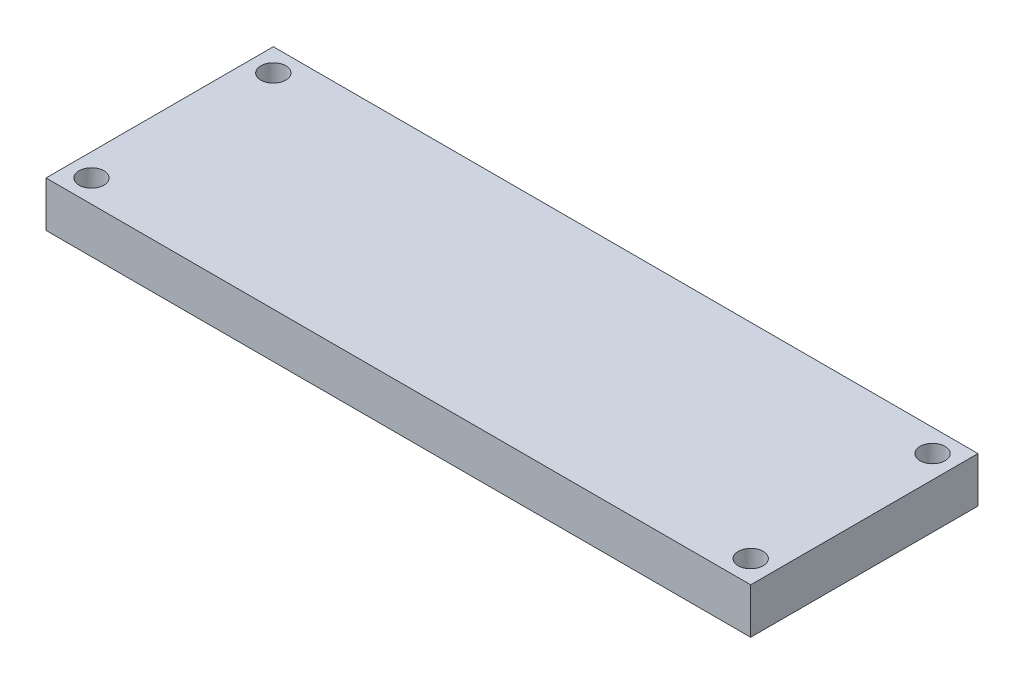
ISO-10303-21;
HEADER;
FILE_DESCRIPTION(('STEP AP214'),'2;1');
FILE_NAME('part.step','',(''),(''),'','','');
FILE_SCHEMA(('AUTOMOTIVE_DESIGN { 1 0 10303 214 1 1 1 1 }'));
ENDSEC;
DATA;
#1=APPLICATION_CONTEXT('core data for automotive mechanical design processes');
#2=APPLICATION_PROTOCOL_DEFINITION('international standard','automotive_design',2000,#1);
#3=PRODUCT_CONTEXT('',#1,'mechanical');
#4=PRODUCT('Part','Part','',(#3));
#5=PRODUCT_RELATED_PRODUCT_CATEGORY('part','',(#4));
#6=PRODUCT_DEFINITION_FORMATION('','',#4);
#7=PRODUCT_DEFINITION_CONTEXT('part definition',#1,'design');
#8=PRODUCT_DEFINITION('design','',#6,#7);
#9=PRODUCT_DEFINITION_SHAPE('','',#8);
#10=(LENGTH_UNIT() NAMED_UNIT(*) SI_UNIT(.MILLI.,.METRE.));
#11=(NAMED_UNIT(*) PLANE_ANGLE_UNIT() SI_UNIT($,.RADIAN.));
#12=(NAMED_UNIT(*) SI_UNIT($,.STERADIAN.) SOLID_ANGLE_UNIT());
#13=UNCERTAINTY_MEASURE_WITH_UNIT(LENGTH_MEASURE(1.E-05),#10,'distance_accuracy_value','');
#14=(GEOMETRIC_REPRESENTATION_CONTEXT(3) GLOBAL_UNCERTAINTY_ASSIGNED_CONTEXT((#13)) GLOBAL_UNIT_ASSIGNED_CONTEXT((#10,
#11,#12)) REPRESENTATION_CONTEXT('',''));
#15=CARTESIAN_POINT('',(0.,0.,0.));
#16=DIRECTION('',(0.,0.,1.));
#17=DIRECTION('',(1.,0.,0.));
#18=AXIS2_PLACEMENT_3D('',#15,#16,#17);
#19=CARTESIAN_POINT('',(0.,2.,0.));
#20=DIRECTION('',(0.,-1.,0.));
#21=DIRECTION('',(0.,0.,-1.));
#22=AXIS2_PLACEMENT_3D('',#19,#20,#21);
#23=PLANE('',#22);
#24=DIRECTION('',(0.,0.,-1.));
#25=VECTOR('',#24,1.);
#26=CARTESIAN_POINT('',(15.5,2.,5.));
#27=LINE('',#26,#25);
#28=CARTESIAN_POINT('',(15.5,2.,5.));
#29=VERTEX_POINT('',#28);
#30=CARTESIAN_POINT('',(15.5,2.,-5.));
#31=VERTEX_POINT('',#30);
#32=EDGE_CURVE('E85',#29,#31,#27,.T.);
#33=ORIENTED_EDGE('',*,*,#32,.T.);
#34=DIRECTION('',(-1.,0.,0.));
#35=VECTOR('',#34,1.);
#36=CARTESIAN_POINT('',(-15.5,2.,-5.));
#37=LINE('',#36,#35);
#38=CARTESIAN_POINT('',(-15.5,2.,-5.));
#39=VERTEX_POINT('',#38);
#40=EDGE_CURVE('E80',#31,#39,#37,.T.);
#41=ORIENTED_EDGE('',*,*,#40,.T.);
#42=DIRECTION('',(0.,0.,1.));
#43=VECTOR('',#42,1.);
#44=CARTESIAN_POINT('',(-15.5,2.,5.));
#45=LINE('',#44,#43);
#46=CARTESIAN_POINT('',(-15.5,2.,5.));
#47=VERTEX_POINT('',#46);
#48=EDGE_CURVE('E83',#39,#47,#45,.T.);
#49=ORIENTED_EDGE('',*,*,#48,.T.);
#50=DIRECTION('',(1.,0.,0.));
#51=VECTOR('',#50,1.);
#52=CARTESIAN_POINT('',(-15.5,2.,5.));
#53=LINE('',#52,#51);
#54=EDGE_CURVE('E50',#47,#29,#53,.T.);
#55=ORIENTED_EDGE('',*,*,#54,.T.);
#56=EDGE_LOOP('',(#33,#41,#49,#55));
#57=FACE_BOUND('',#56,.T.);
#58=CARTESIAN_POINT('',(-14.5,2.,-4.));
#59=DIRECTION('',(0.,1.,0.));
#60=DIRECTION('',(0.,0.,1.));
#61=AXIS2_PLACEMENT_3D('',#58,#59,#60);
#62=CIRCLE('',#61,0.55);
#63=CARTESIAN_POINT('',(-14.5,2.,-3.45));
#64=VERTEX_POINT('',#63);
#65=EDGE_CURVE('E100',#64,#64,#62,.T.);
#66=ORIENTED_EDGE('',*,*,#65,.F.);
#67=EDGE_LOOP('',(#66));
#68=FACE_BOUND('',#67,.T.);
#69=CARTESIAN_POINT('',(14.5,2.,-4.));
#70=DIRECTION('',(0.,1.,0.));
#71=DIRECTION('',(0.,0.,1.));
#72=AXIS2_PLACEMENT_3D('',#69,#70,#71);
#73=CIRCLE('',#72,0.55);
#74=CARTESIAN_POINT('',(14.5,2.,-3.45));
#75=VERTEX_POINT('',#74);
#76=EDGE_CURVE('E115',#75,#75,#73,.T.);
#77=ORIENTED_EDGE('',*,*,#76,.F.);
#78=EDGE_LOOP('',(#77));
#79=FACE_BOUND('',#78,.T.);
#80=CARTESIAN_POINT('',(14.5000000000001,2.,4.));
#81=DIRECTION('',(0.,1.,0.));
#82=DIRECTION('',(0.,0.,1.));
#83=AXIS2_PLACEMENT_3D('',#80,#81,#82);
#84=CIRCLE('',#83,0.55);
#85=CARTESIAN_POINT('',(14.5000000000001,2.,4.55));
#86=VERTEX_POINT('',#85);
#87=EDGE_CURVE('E121',#86,#86,#84,.T.);
#88=ORIENTED_EDGE('',*,*,#87,.F.);
#89=EDGE_LOOP('',(#88));
#90=FACE_BOUND('',#89,.T.);
#91=CARTESIAN_POINT('',(-14.4999999999999,2.,4.));
#92=DIRECTION('',(0.,1.,0.));
#93=DIRECTION('',(0.,0.,1.));
#94=AXIS2_PLACEMENT_3D('',#91,#92,#93);
#95=CIRCLE('',#94,0.55);
#96=CARTESIAN_POINT('',(-14.4999999999999,2.,4.55));
#97=VERTEX_POINT('',#96);
#98=EDGE_CURVE('E127',#97,#97,#95,.T.);
#99=ORIENTED_EDGE('',*,*,#98,.F.);
#100=EDGE_LOOP('',(#99));
#101=FACE_BOUND('',#100,.T.);
#102=ADVANCED_FACE('F33',(#57,#68,#79,#90,#101),#23,.F.);
#103=CARTESIAN_POINT('',(0.,0.,0.));
#104=DIRECTION('',(0.,-1.,0.));
#105=DIRECTION('',(0.,0.,-1.));
#106=AXIS2_PLACEMENT_3D('',#103,#104,#105);
#107=PLANE('',#106);
#108=CARTESIAN_POINT('',(14.5000000000001,0.,4.));
#109=DIRECTION('',(0.,1.,0.));
#110=DIRECTION('',(0.,0.,1.));
#111=AXIS2_PLACEMENT_3D('',#108,#109,#110);
#112=CIRCLE('',#111,0.55);
#113=CARTESIAN_POINT('',(14.5000000000001,0.,4.55));
#114=VERTEX_POINT('',#113);
#115=EDGE_CURVE('E124',#114,#114,#112,.T.);
#116=ORIENTED_EDGE('',*,*,#115,.T.);
#117=EDGE_LOOP('',(#116));
#118=FACE_BOUND('',#117,.T.);
#119=CARTESIAN_POINT('',(-14.5,0.,-4.));
#120=DIRECTION('',(0.,1.,0.));
#121=DIRECTION('',(0.,0.,1.));
#122=AXIS2_PLACEMENT_3D('',#119,#120,#121);
#123=CIRCLE('',#122,0.55);
#124=CARTESIAN_POINT('',(-14.5,0.,-3.45));
#125=VERTEX_POINT('',#124);
#126=EDGE_CURVE('E112',#125,#125,#123,.T.);
#127=ORIENTED_EDGE('',*,*,#126,.T.);
#128=EDGE_LOOP('',(#127));
#129=FACE_BOUND('',#128,.T.);
#130=DIRECTION('',(0.,0.,-1.));
#131=VECTOR('',#130,1.);
#132=CARTESIAN_POINT('',(15.5,0.,5.));
#133=LINE('',#132,#131);
#134=CARTESIAN_POINT('',(15.5,0.,5.));
#135=VERTEX_POINT('',#134);
#136=CARTESIAN_POINT('',(15.5,0.,-5.));
#137=VERTEX_POINT('',#136);
#138=EDGE_CURVE('E97',#135,#137,#133,.T.);
#139=ORIENTED_EDGE('',*,*,#138,.F.);
#140=DIRECTION('',(1.,0.,0.));
#141=VECTOR('',#140,1.);
#142=CARTESIAN_POINT('',(-15.5,0.,5.));
#143=LINE('',#142,#141);
#144=CARTESIAN_POINT('',(-15.5,0.,5.));
#145=VERTEX_POINT('',#144);
#146=EDGE_CURVE('E73',#145,#135,#143,.T.);
#147=ORIENTED_EDGE('',*,*,#146,.F.);
#148=DIRECTION('',(0.,0.,1.));
#149=VECTOR('',#148,1.);
#150=CARTESIAN_POINT('',(-15.5,0.,5.));
#151=LINE('',#150,#149);
#152=CARTESIAN_POINT('',(-15.5,0.,-5.));
#153=VERTEX_POINT('',#152);
#154=EDGE_CURVE('E67',#153,#145,#151,.T.);
#155=ORIENTED_EDGE('',*,*,#154,.F.);
#156=DIRECTION('',(-1.,0.,0.));
#157=VECTOR('',#156,1.);
#158=CARTESIAN_POINT('',(-15.5,0.,-5.));
#159=LINE('',#158,#157);
#160=EDGE_CURVE('E89',#137,#153,#159,.T.);
#161=ORIENTED_EDGE('',*,*,#160,.F.);
#162=EDGE_LOOP('',(#139,#147,#155,#161));
#163=FACE_BOUND('',#162,.T.);
#164=CARTESIAN_POINT('',(14.5,0.,-4.));
#165=DIRECTION('',(0.,1.,0.));
#166=DIRECTION('',(0.,0.,1.));
#167=AXIS2_PLACEMENT_3D('',#164,#165,#166);
#168=CIRCLE('',#167,0.55);
#169=CARTESIAN_POINT('',(14.5,0.,-3.45));
#170=VERTEX_POINT('',#169);
#171=EDGE_CURVE('E118',#170,#170,#168,.T.);
#172=ORIENTED_EDGE('',*,*,#171,.T.);
#173=EDGE_LOOP('',(#172));
#174=FACE_BOUND('',#173,.T.);
#175=CARTESIAN_POINT('',(-14.4999999999999,0.,4.));
#176=DIRECTION('',(0.,1.,0.));
#177=DIRECTION('',(0.,0.,1.));
#178=AXIS2_PLACEMENT_3D('',#175,#176,#177);
#179=CIRCLE('',#178,0.55);
#180=CARTESIAN_POINT('',(-14.4999999999999,0.,4.55));
#181=VERTEX_POINT('',#180);
#182=EDGE_CURVE('E130',#181,#181,#179,.T.);
#183=ORIENTED_EDGE('',*,*,#182,.T.);
#184=EDGE_LOOP('',(#183));
#185=FACE_BOUND('',#184,.T.);
#186=ADVANCED_FACE('F108',(#118,#129,#163,#174,#185),#107,.T.);
#187=CARTESIAN_POINT('',(15.5,2.,5.));
#188=DIRECTION('',(-1.,0.,0.));
#189=DIRECTION('',(0.,0.,1.));
#190=AXIS2_PLACEMENT_3D('',#187,#188,#189);
#191=PLANE('',#190);
#192=ORIENTED_EDGE('',*,*,#138,.T.);
#193=DIRECTION('',(0.,-1.,0.));
#194=VECTOR('',#193,1.);
#195=CARTESIAN_POINT('',(15.5,2.,-5.));
#196=LINE('',#195,#194);
#197=EDGE_CURVE('E11',#31,#137,#196,.T.);
#198=ORIENTED_EDGE('',*,*,#197,.F.);
#199=ORIENTED_EDGE('',*,*,#32,.F.);
#200=DIRECTION('',(0.,-1.,0.));
#201=VECTOR('',#200,1.);
#202=CARTESIAN_POINT('',(15.5,2.,5.));
#203=LINE('',#202,#201);
#204=EDGE_CURVE('E93',#29,#135,#203,.T.);
#205=ORIENTED_EDGE('',*,*,#204,.T.);
#206=EDGE_LOOP('',(#192,#198,#199,#205));
#207=FACE_BOUND('',#206,.T.);
#208=ADVANCED_FACE('F35',(#207),#191,.F.);
#209=CARTESIAN_POINT('',(-15.5,2.,-5.));
#210=DIRECTION('',(0.,0.,1.));
#211=DIRECTION('',(1.,0.,0.));
#212=AXIS2_PLACEMENT_3D('',#209,#210,#211);
#213=PLANE('',#212);
#214=ORIENTED_EDGE('',*,*,#160,.T.);
#215=DIRECTION('',(0.,-1.,0.));
#216=VECTOR('',#215,1.);
#217=CARTESIAN_POINT('',(-15.5,2.,-5.));
#218=LINE('',#217,#216);
#219=EDGE_CURVE('E42',#39,#153,#218,.T.);
#220=ORIENTED_EDGE('',*,*,#219,.F.);
#221=ORIENTED_EDGE('',*,*,#40,.F.);
#222=ORIENTED_EDGE('',*,*,#197,.T.);
#223=EDGE_LOOP('',(#214,#220,#221,#222));
#224=FACE_BOUND('',#223,.T.);
#225=ADVANCED_FACE('F88',(#224),#213,.F.);
#226=CARTESIAN_POINT('',(-15.5,2.,5.));
#227=DIRECTION('',(1.,0.,0.));
#228=DIRECTION('',(0.,0.,-1.));
#229=AXIS2_PLACEMENT_3D('',#226,#227,#228);
#230=PLANE('',#229);
#231=ORIENTED_EDGE('',*,*,#154,.T.);
#232=DIRECTION('',(0.,-1.,0.));
#233=VECTOR('',#232,1.);
#234=CARTESIAN_POINT('',(-15.5,2.,5.));
#235=LINE('',#234,#233);
#236=EDGE_CURVE('E90',#47,#145,#235,.T.);
#237=ORIENTED_EDGE('',*,*,#236,.F.);
#238=ORIENTED_EDGE('',*,*,#48,.F.);
#239=ORIENTED_EDGE('',*,*,#219,.T.);
#240=EDGE_LOOP('',(#231,#237,#238,#239));
#241=FACE_BOUND('',#240,.T.);
#242=ADVANCED_FACE('F91',(#241),#230,.F.);
#243=CARTESIAN_POINT('',(-15.5,2.,5.));
#244=DIRECTION('',(0.,0.,-1.));
#245=DIRECTION('',(-1.,0.,0.));
#246=AXIS2_PLACEMENT_3D('',#243,#244,#245);
#247=PLANE('',#246);
#248=ORIENTED_EDGE('',*,*,#146,.T.);
#249=ORIENTED_EDGE('',*,*,#204,.F.);
#250=ORIENTED_EDGE('',*,*,#54,.F.);
#251=ORIENTED_EDGE('',*,*,#236,.T.);
#252=EDGE_LOOP('',(#248,#249,#250,#251));
#253=FACE_BOUND('',#252,.T.);
#254=ADVANCED_FACE('F105',(#253),#247,.F.);
#255=CARTESIAN_POINT('',(-14.5,2.,-4.));
#256=DIRECTION('',(0.,-1.,0.));
#257=DIRECTION('',(0.,0.,-1.));
#258=AXIS2_PLACEMENT_3D('',#255,#256,#257);
#259=CYLINDRICAL_SURFACE('',#258,0.55);
#260=ORIENTED_EDGE('',*,*,#65,.T.);
#261=EDGE_LOOP('',(#260));
#262=FACE_BOUND('',#261,.T.);
#263=ORIENTED_EDGE('',*,*,#126,.F.);
#264=EDGE_LOOP('',(#263));
#265=FACE_BOUND('',#264,.T.);
#266=ADVANCED_FACE('F147',(#262,#265),#259,.F.);
#267=CARTESIAN_POINT('',(14.5,2.,-4.));
#268=DIRECTION('',(0.,-1.,0.));
#269=DIRECTION('',(0.,0.,-1.));
#270=AXIS2_PLACEMENT_3D('',#267,#268,#269);
#271=CYLINDRICAL_SURFACE('',#270,0.55);
#272=ORIENTED_EDGE('',*,*,#76,.T.);
#273=EDGE_LOOP('',(#272));
#274=FACE_BOUND('',#273,.T.);
#275=ORIENTED_EDGE('',*,*,#171,.F.);
#276=EDGE_LOOP('',(#275));
#277=FACE_BOUND('',#276,.T.);
#278=ADVANCED_FACE('F193',(#274,#277),#271,.F.);
#279=CARTESIAN_POINT('',(14.5000000000001,2.,4.));
#280=DIRECTION('',(0.,-1.,0.));
#281=DIRECTION('',(0.,0.,-1.));
#282=AXIS2_PLACEMENT_3D('',#279,#280,#281);
#283=CYLINDRICAL_SURFACE('',#282,0.55);
#284=ORIENTED_EDGE('',*,*,#87,.T.);
#285=EDGE_LOOP('',(#284));
#286=FACE_BOUND('',#285,.T.);
#287=ORIENTED_EDGE('',*,*,#115,.F.);
#288=EDGE_LOOP('',(#287));
#289=FACE_BOUND('',#288,.T.);
#290=ADVANCED_FACE('F201',(#286,#289),#283,.F.);
#291=CARTESIAN_POINT('',(-14.4999999999999,2.,4.));
#292=DIRECTION('',(0.,-1.,0.));
#293=DIRECTION('',(0.,0.,-1.));
#294=AXIS2_PLACEMENT_3D('',#291,#292,#293);
#295=CYLINDRICAL_SURFACE('',#294,0.55);
#296=ORIENTED_EDGE('',*,*,#98,.T.);
#297=EDGE_LOOP('',(#296));
#298=FACE_BOUND('',#297,.T.);
#299=ORIENTED_EDGE('',*,*,#182,.F.);
#300=EDGE_LOOP('',(#299));
#301=FACE_BOUND('',#300,.T.);
#302=ADVANCED_FACE('F136',(#298,#301),#295,.F.);
#303=CLOSED_SHELL('',(#102,#186,#208,#225,#242,#254,#266,#278,#290,#302));
#304=MANIFOLD_SOLID_BREP('B2',#303);
#305=ADVANCED_BREP_SHAPE_REPRESENTATION('',(#18,#304),#14);
#306=SHAPE_DEFINITION_REPRESENTATION(#9,#305);
ENDSEC;
END-ISO-10303-21;
